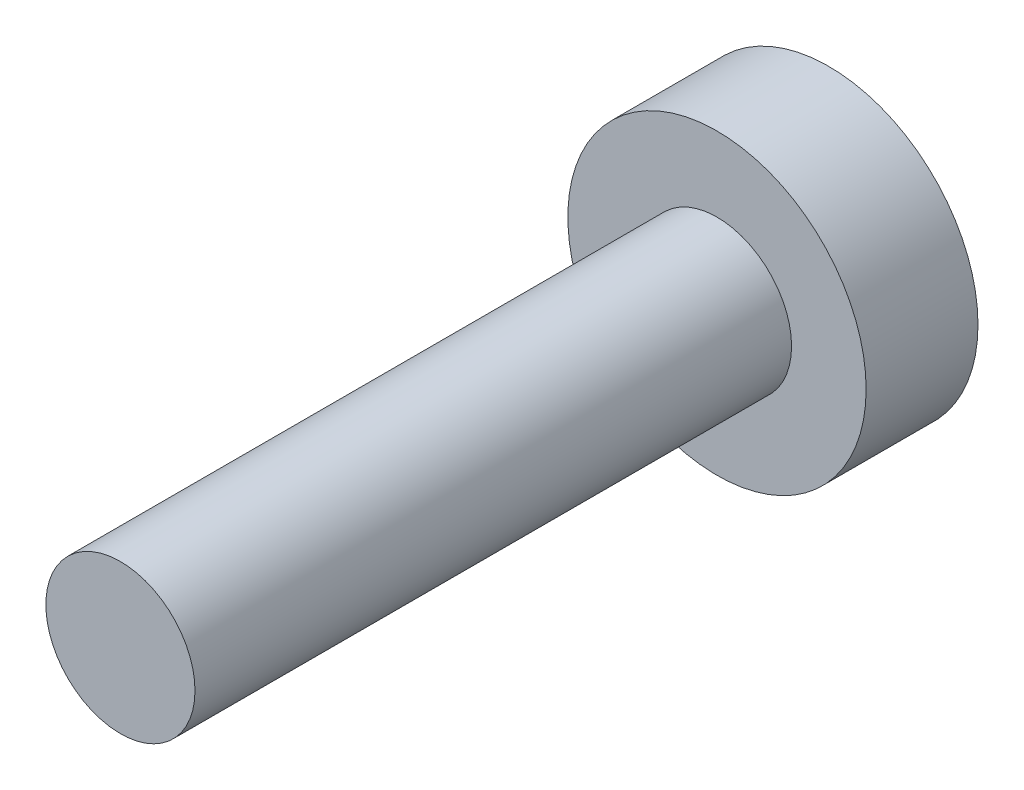
ISO-10303-21;
HEADER;
FILE_DESCRIPTION(('STEP AP214'),'2;1');
FILE_NAME('part.step','',(''),(''),'','','');
FILE_SCHEMA(('AUTOMOTIVE_DESIGN { 1 0 10303 214 1 1 1 1 }'));
ENDSEC;
DATA;
#1=APPLICATION_CONTEXT('core data for automotive mechanical design processes');
#2=APPLICATION_PROTOCOL_DEFINITION('international standard','automotive_design',2000,#1);
#3=PRODUCT_CONTEXT('',#1,'mechanical');
#4=PRODUCT('Part','Part','',(#3));
#5=PRODUCT_RELATED_PRODUCT_CATEGORY('part','',(#4));
#6=PRODUCT_DEFINITION_FORMATION('','',#4);
#7=PRODUCT_DEFINITION_CONTEXT('part definition',#1,'design');
#8=PRODUCT_DEFINITION('design','',#6,#7);
#9=PRODUCT_DEFINITION_SHAPE('','',#8);
#10=(LENGTH_UNIT() NAMED_UNIT(*) SI_UNIT(.MILLI.,.METRE.));
#11=(NAMED_UNIT(*) PLANE_ANGLE_UNIT() SI_UNIT($,.RADIAN.));
#12=(NAMED_UNIT(*) SI_UNIT($,.STERADIAN.) SOLID_ANGLE_UNIT());
#13=UNCERTAINTY_MEASURE_WITH_UNIT(LENGTH_MEASURE(1.E-05),#10,'distance_accuracy_value','');
#14=(GEOMETRIC_REPRESENTATION_CONTEXT(3) GLOBAL_UNCERTAINTY_ASSIGNED_CONTEXT((#13)) GLOBAL_UNIT_ASSIGNED_CONTEXT((#10,
#11,#12)) REPRESENTATION_CONTEXT('',''));
#15=CARTESIAN_POINT('',(0.,0.,0.));
#16=DIRECTION('',(0.,0.,1.));
#17=DIRECTION('',(1.,0.,0.));
#18=AXIS2_PLACEMENT_3D('',#15,#16,#17);
#19=CARTESIAN_POINT('',(0.,0.,8.));
#20=DIRECTION('',(0.,0.,1.));
#21=DIRECTION('',(1.,0.,0.));
#22=AXIS2_PLACEMENT_3D('',#19,#20,#21);
#23=PLANE('',#22);
#24=CARTESIAN_POINT('',(0.,0.,8.));
#25=DIRECTION('',(0.,0.,1.));
#26=DIRECTION('',(1.,0.,0.));
#27=AXIS2_PLACEMENT_3D('',#24,#25,#26);
#28=CIRCLE('',#27,1.);
#29=CARTESIAN_POINT('',(1.,0.,8.));
#30=VERTEX_POINT('',#29);
#31=EDGE_CURVE('E25',#30,#30,#28,.T.);
#32=ORIENTED_EDGE('',*,*,#31,.T.);
#33=EDGE_LOOP('',(#32));
#34=FACE_BOUND('',#33,.T.);
#35=ADVANCED_FACE('F17',(#34),#23,.T.);
#36=CARTESIAN_POINT('',(0.,0.,0.));
#37=DIRECTION('',(0.,0.,1.));
#38=DIRECTION('',(1.,0.,0.));
#39=AXIS2_PLACEMENT_3D('',#36,#37,#38);
#40=CYLINDRICAL_SURFACE('',#39,1.);
#41=ORIENTED_EDGE('',*,*,#31,.F.);
#42=DIRECTION('',(0.,0.,1.));
#43=VECTOR('',#42,1.);
#44=CARTESIAN_POINT('',(1.,0.,0.));
#45=LINE('',#44,#43);
#46=CARTESIAN_POINT('',(1.,0.,0.));
#47=VERTEX_POINT('',#46);
#48=EDGE_CURVE('E11',#47,#30,#45,.T.);
#49=ORIENTED_EDGE('',*,*,#48,.F.);
#50=CARTESIAN_POINT('',(0.,0.,0.));
#51=DIRECTION('',(0.,0.,1.));
#52=DIRECTION('',(1.,0.,0.));
#53=AXIS2_PLACEMENT_3D('',#50,#51,#52);
#54=CIRCLE('',#53,1.);
#55=EDGE_CURVE('E67',#47,#47,#54,.T.);
#56=ORIENTED_EDGE('',*,*,#55,.T.);
#57=ORIENTED_EDGE('',*,*,#48,.T.);
#58=EDGE_LOOP('',(#41,#49,#56,#57));
#59=FACE_BOUND('',#58,.T.);
#60=ADVANCED_FACE('F72',(#59),#40,.T.);
#61=CARTESIAN_POINT('',(0.,0.,-1.5));
#62=DIRECTION('',(0.,0.,1.));
#63=DIRECTION('',(1.,0.,0.));
#64=AXIS2_PLACEMENT_3D('',#61,#62,#63);
#65=PLANE('',#64);
#66=CARTESIAN_POINT('',(0.,0.,-1.5));
#67=DIRECTION('',(0.,0.,1.));
#68=DIRECTION('',(1.,0.,0.));
#69=AXIS2_PLACEMENT_3D('',#66,#67,#68);
#70=CIRCLE('',#69,2.);
#71=CARTESIAN_POINT('',(2.,0.,-1.5));
#72=VERTEX_POINT('',#71);
#73=EDGE_CURVE('E56',#72,#72,#70,.T.);
#74=ORIENTED_EDGE('',*,*,#73,.F.);
#75=EDGE_LOOP('',(#74));
#76=FACE_BOUND('',#75,.T.);
#77=ADVANCED_FACE('F75',(#76),#65,.F.);
#78=CARTESIAN_POINT('',(0.,0.,0.));
#79=DIRECTION('',(0.,0.,1.));
#80=DIRECTION('',(1.,0.,0.));
#81=AXIS2_PLACEMENT_3D('',#78,#79,#80);
#82=PLANE('',#81);
#83=ORIENTED_EDGE('',*,*,#55,.F.);
#84=EDGE_LOOP('',(#83));
#85=FACE_BOUND('',#84,.T.);
#86=CARTESIAN_POINT('',(0.,0.,0.));
#87=DIRECTION('',(0.,0.,1.));
#88=DIRECTION('',(1.,0.,0.));
#89=AXIS2_PLACEMENT_3D('',#86,#87,#88);
#90=CIRCLE('',#89,2.);
#91=CARTESIAN_POINT('',(2.,0.,0.));
#92=VERTEX_POINT('',#91);
#93=EDGE_CURVE('E54',#92,#92,#90,.T.);
#94=ORIENTED_EDGE('',*,*,#93,.T.);
#95=EDGE_LOOP('',(#94));
#96=FACE_BOUND('',#95,.T.);
#97=ADVANCED_FACE('F60',(#85,#96),#82,.T.);
#98=CARTESIAN_POINT('',(0.,0.,-1.5));
#99=DIRECTION('',(0.,0.,1.));
#100=DIRECTION('',(1.,0.,0.));
#101=AXIS2_PLACEMENT_3D('',#98,#99,#100);
#102=CYLINDRICAL_SURFACE('',#101,2.);
#103=ORIENTED_EDGE('',*,*,#93,.F.);
#104=DIRECTION('',(0.,0.,1.));
#105=VECTOR('',#104,1.);
#106=CARTESIAN_POINT('',(2.,0.,-1.5));
#107=LINE('',#106,#105);
#108=EDGE_CURVE('E51',#72,#92,#107,.T.);
#109=ORIENTED_EDGE('',*,*,#108,.F.);
#110=ORIENTED_EDGE('',*,*,#73,.T.);
#111=ORIENTED_EDGE('',*,*,#108,.T.);
#112=EDGE_LOOP('',(#103,#109,#110,#111));
#113=FACE_BOUND('',#112,.T.);
#114=ADVANCED_FACE('F53',(#113),#102,.T.);
#115=CLOSED_SHELL('',(#35,#60,#77,#97,#114));
#116=MANIFOLD_SOLID_BREP('B1',#115);
#117=ADVANCED_BREP_SHAPE_REPRESENTATION('',(#18,#116),#14);
#118=SHAPE_DEFINITION_REPRESENTATION(#9,#117);
ENDSEC;
END-ISO-10303-21;
